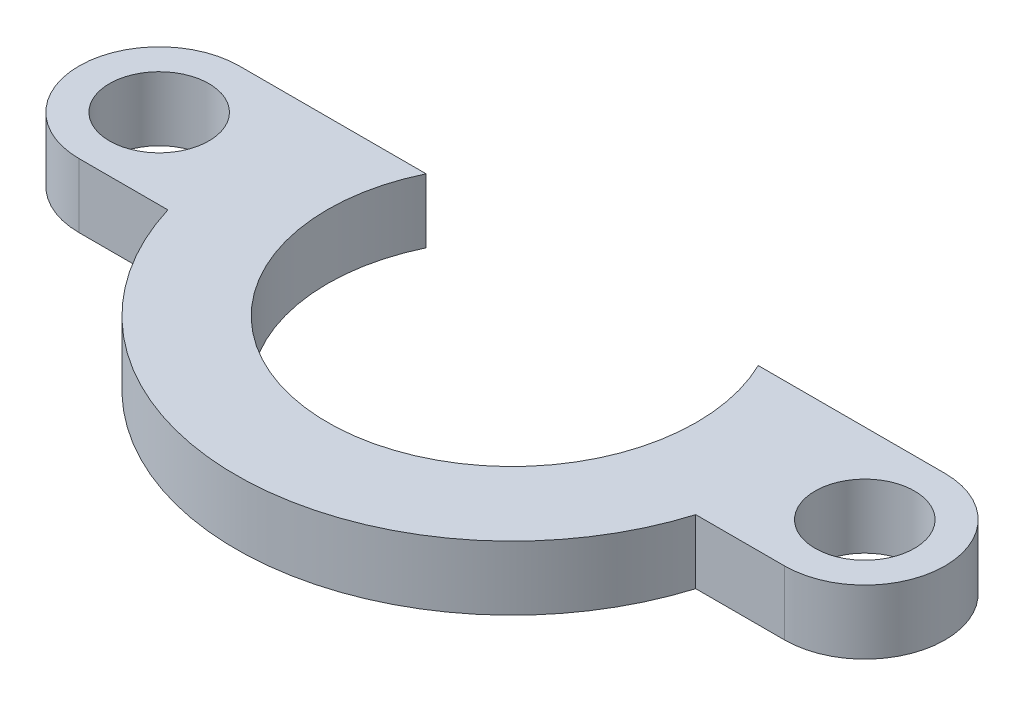
ISO-10303-21;
HEADER;
FILE_DESCRIPTION(('STEP AP214'),'2;1');
FILE_NAME('part.step','',(''),(''),'','','');
FILE_SCHEMA(('AUTOMOTIVE_DESIGN { 1 0 10303 214 1 1 1 1 }'));
ENDSEC;
DATA;
#1=APPLICATION_CONTEXT('core data for automotive mechanical design processes');
#2=APPLICATION_PROTOCOL_DEFINITION('international standard','automotive_design',2000,#1);
#3=PRODUCT_CONTEXT('',#1,'mechanical');
#4=PRODUCT('Part','Part','',(#3));
#5=PRODUCT_RELATED_PRODUCT_CATEGORY('part','',(#4));
#6=PRODUCT_DEFINITION_FORMATION('','',#4);
#7=PRODUCT_DEFINITION_CONTEXT('part definition',#1,'design');
#8=PRODUCT_DEFINITION('design','',#6,#7);
#9=PRODUCT_DEFINITION_SHAPE('','',#8);
#10=(LENGTH_UNIT() NAMED_UNIT(*) SI_UNIT(.MILLI.,.METRE.));
#11=(NAMED_UNIT(*) PLANE_ANGLE_UNIT() SI_UNIT($,.RADIAN.));
#12=(NAMED_UNIT(*) SI_UNIT($,.STERADIAN.) SOLID_ANGLE_UNIT());
#13=UNCERTAINTY_MEASURE_WITH_UNIT(LENGTH_MEASURE(1.E-05),#10,'distance_accuracy_value','');
#14=(GEOMETRIC_REPRESENTATION_CONTEXT(3) GLOBAL_UNCERTAINTY_ASSIGNED_CONTEXT((#13)) GLOBAL_UNIT_ASSIGNED_CONTEXT((#10,
#11,#12)) REPRESENTATION_CONTEXT('',''));
#15=CARTESIAN_POINT('',(0.,0.,0.));
#16=DIRECTION('',(0.,0.,1.));
#17=DIRECTION('',(1.,0.,0.));
#18=AXIS2_PLACEMENT_3D('',#15,#16,#17);
#19=CARTESIAN_POINT('',(0.,0.,0.));
#20=DIRECTION('',(0.,1.,0.));
#21=DIRECTION('',(0.,0.,1.));
#22=AXIS2_PLACEMENT_3D('',#19,#20,#21);
#23=PLANE('',#22);
#24=CARTESIAN_POINT('',(-11.,0.,0.));
#25=DIRECTION('',(0.,1.,0.));
#26=DIRECTION('',(0.,0.,1.));
#27=AXIS2_PLACEMENT_3D('',#24,#25,#26);
#28=CIRCLE('',#27,2.5);
#29=CARTESIAN_POINT('',(-11.,0.,-2.5));
#30=VERTEX_POINT('',#29);
#31=CARTESIAN_POINT('',(-11.,0.,2.5));
#32=VERTEX_POINT('',#31);
#33=EDGE_CURVE('E115',#30,#32,#28,.T.);
#34=ORIENTED_EDGE('',*,*,#33,.F.);
#35=DIRECTION('',(1.,0.,0.));
#36=VECTOR('',#35,1.);
#37=CARTESIAN_POINT('',(0.,0.,-2.5));
#38=LINE('',#37,#36);
#39=CARTESIAN_POINT('',(-5.178078794302,0.,-2.5));
#40=VERTEX_POINT('',#39);
#41=EDGE_CURVE('E223',#30,#40,#38,.T.);
#42=ORIENTED_EDGE('',*,*,#41,.T.);
#43=CARTESIAN_POINT('',(0.,0.,0.));
#44=DIRECTION('',(0.,1.,0.));
#45=DIRECTION('',(0.,0.,1.));
#46=AXIS2_PLACEMENT_3D('',#43,#44,#45);
#47=CIRCLE('',#46,5.75);
#48=CARTESIAN_POINT('',(5.17807879430199,0.,-2.5));
#49=VERTEX_POINT('',#48);
#50=EDGE_CURVE('E220',#40,#49,#47,.T.);
#51=ORIENTED_EDGE('',*,*,#50,.T.);
#52=DIRECTION('',(1.,0.,0.));
#53=VECTOR('',#52,1.);
#54=CARTESIAN_POINT('',(0.,0.,-2.5));
#55=LINE('',#54,#53);
#56=CARTESIAN_POINT('',(11.,0.,-2.5));
#57=VERTEX_POINT('',#56);
#58=EDGE_CURVE('E217',#49,#57,#55,.T.);
#59=ORIENTED_EDGE('',*,*,#58,.T.);
#60=CARTESIAN_POINT('',(11.,0.,0.));
#61=DIRECTION('',(0.,1.,0.));
#62=DIRECTION('',(0.,0.,1.));
#63=AXIS2_PLACEMENT_3D('',#60,#61,#62);
#64=CIRCLE('',#63,2.5);
#65=CARTESIAN_POINT('',(11.,0.,2.5));
#66=VERTEX_POINT('',#65);
#67=EDGE_CURVE('E214',#66,#57,#64,.T.);
#68=ORIENTED_EDGE('',*,*,#67,.F.);
#69=DIRECTION('',(1.,0.,0.));
#70=VECTOR('',#69,1.);
#71=CARTESIAN_POINT('',(0.,0.,2.5));
#72=LINE('',#71,#70);
#73=CARTESIAN_POINT('',(8.22860863086828,0.,2.5));
#74=VERTEX_POINT('',#73);
#75=EDGE_CURVE('E164',#74,#66,#72,.T.);
#76=ORIENTED_EDGE('',*,*,#75,.F.);
#77=CARTESIAN_POINT('',(0.,0.,0.));
#78=DIRECTION('',(0.,1.,0.));
#79=DIRECTION('',(0.,0.,1.));
#80=AXIS2_PLACEMENT_3D('',#77,#78,#79);
#81=CIRCLE('',#80,8.6);
#82=CARTESIAN_POINT('',(-8.22860863086828,0.,2.5));
#83=VERTEX_POINT('',#82);
#84=EDGE_CURVE('E158',#83,#74,#81,.T.);
#85=ORIENTED_EDGE('',*,*,#84,.F.);
#86=DIRECTION('',(1.,0.,0.));
#87=VECTOR('',#86,1.);
#88=CARTESIAN_POINT('',(0.,0.,2.5));
#89=LINE('',#88,#87);
#90=EDGE_CURVE('E201',#32,#83,#89,.T.);
#91=ORIENTED_EDGE('',*,*,#90,.F.);
#92=EDGE_LOOP('',(#34,#42,#51,#59,#68,#76,#85,#91));
#93=FACE_BOUND('',#92,.T.);
#94=CARTESIAN_POINT('',(11.,0.,0.));
#95=DIRECTION('',(0.,1.,0.));
#96=DIRECTION('',(0.,0.,1.));
#97=AXIS2_PLACEMENT_3D('',#94,#95,#96);
#98=CIRCLE('',#97,1.55);
#99=CARTESIAN_POINT('',(11.,0.,1.55));
#100=VERTEX_POINT('',#99);
#101=EDGE_CURVE('E211',#100,#100,#98,.T.);
#102=ORIENTED_EDGE('',*,*,#101,.T.);
#103=EDGE_LOOP('',(#102));
#104=FACE_BOUND('',#103,.T.);
#105=CARTESIAN_POINT('',(-11.,0.,0.));
#106=DIRECTION('',(0.,1.,0.));
#107=DIRECTION('',(0.,0.,1.));
#108=AXIS2_PLACEMENT_3D('',#105,#106,#107);
#109=CIRCLE('',#108,1.55);
#110=CARTESIAN_POINT('',(-11.,0.,1.55));
#111=VERTEX_POINT('',#110);
#112=EDGE_CURVE('E241',#111,#111,#109,.T.);
#113=ORIENTED_EDGE('',*,*,#112,.T.);
#114=EDGE_LOOP('',(#113));
#115=FACE_BOUND('',#114,.T.);
#116=ADVANCED_FACE('F111',(#93,#104,#115),#23,.F.);
#117=CARTESIAN_POINT('',(0.,2.,0.));
#118=DIRECTION('',(0.,1.,0.));
#119=DIRECTION('',(0.,0.,1.));
#120=AXIS2_PLACEMENT_3D('',#117,#118,#119);
#121=PLANE('',#120);
#122=DIRECTION('',(1.,0.,0.));
#123=VECTOR('',#122,1.);
#124=CARTESIAN_POINT('',(0.,2.,-2.5));
#125=LINE('',#124,#123);
#126=CARTESIAN_POINT('',(-11.,2.,-2.5));
#127=VERTEX_POINT('',#126);
#128=CARTESIAN_POINT('',(-5.178078794302,2.,-2.5));
#129=VERTEX_POINT('',#128);
#130=EDGE_CURVE('E196',#127,#129,#125,.T.);
#131=ORIENTED_EDGE('',*,*,#130,.F.);
#132=CARTESIAN_POINT('',(-11.,2.,0.));
#133=DIRECTION('',(0.,1.,0.));
#134=DIRECTION('',(0.,0.,1.));
#135=AXIS2_PLACEMENT_3D('',#132,#133,#134);
#136=CIRCLE('',#135,2.5);
#137=CARTESIAN_POINT('',(-11.,2.,2.5));
#138=VERTEX_POINT('',#137);
#139=EDGE_CURVE('E194',#127,#138,#136,.T.);
#140=ORIENTED_EDGE('',*,*,#139,.T.);
#141=DIRECTION('',(1.,0.,0.));
#142=VECTOR('',#141,1.);
#143=CARTESIAN_POINT('',(0.,2.,2.5));
#144=LINE('',#143,#142);
#145=CARTESIAN_POINT('',(-8.22860863086828,2.,2.5));
#146=VERTEX_POINT('',#145);
#147=EDGE_CURVE('E186',#138,#146,#144,.T.);
#148=ORIENTED_EDGE('',*,*,#147,.T.);
#149=CARTESIAN_POINT('',(0.,2.,0.));
#150=DIRECTION('',(0.,1.,0.));
#151=DIRECTION('',(0.,0.,1.));
#152=AXIS2_PLACEMENT_3D('',#149,#150,#151);
#153=CIRCLE('',#152,8.6);
#154=CARTESIAN_POINT('',(8.22860863086828,2.,2.5));
#155=VERTEX_POINT('',#154);
#156=EDGE_CURVE('E192',#146,#155,#153,.T.);
#157=ORIENTED_EDGE('',*,*,#156,.T.);
#158=DIRECTION('',(1.,0.,0.));
#159=VECTOR('',#158,1.);
#160=CARTESIAN_POINT('',(0.,2.,2.5));
#161=LINE('',#160,#159);
#162=CARTESIAN_POINT('',(11.,2.,2.5));
#163=VERTEX_POINT('',#162);
#164=EDGE_CURVE('E130',#155,#163,#161,.T.);
#165=ORIENTED_EDGE('',*,*,#164,.T.);
#166=CARTESIAN_POINT('',(11.,2.,0.));
#167=DIRECTION('',(0.,1.,0.));
#168=DIRECTION('',(0.,0.,1.));
#169=AXIS2_PLACEMENT_3D('',#166,#167,#168);
#170=CIRCLE('',#169,2.5);
#171=CARTESIAN_POINT('',(11.,2.,-2.5));
#172=VERTEX_POINT('',#171);
#173=EDGE_CURVE('E170',#163,#172,#170,.T.);
#174=ORIENTED_EDGE('',*,*,#173,.T.);
#175=DIRECTION('',(1.,0.,0.));
#176=VECTOR('',#175,1.);
#177=CARTESIAN_POINT('',(0.,2.,-2.5));
#178=LINE('',#177,#176);
#179=CARTESIAN_POINT('',(5.17807879430199,2.,-2.5));
#180=VERTEX_POINT('',#179);
#181=EDGE_CURVE('E447',#180,#172,#178,.T.);
#182=ORIENTED_EDGE('',*,*,#181,.F.);
#183=CARTESIAN_POINT('',(0.,2.,0.));
#184=DIRECTION('',(0.,1.,0.));
#185=DIRECTION('',(0.,0.,1.));
#186=AXIS2_PLACEMENT_3D('',#183,#184,#185);
#187=CIRCLE('',#186,5.75);
#188=EDGE_CURVE('E451',#129,#180,#187,.T.);
#189=ORIENTED_EDGE('',*,*,#188,.F.);
#190=EDGE_LOOP('',(#131,#140,#148,#157,#165,#174,#182,#189));
#191=FACE_BOUND('',#190,.T.);
#192=CARTESIAN_POINT('',(11.,2.,0.));
#193=DIRECTION('',(0.,1.,0.));
#194=DIRECTION('',(0.,0.,1.));
#195=AXIS2_PLACEMENT_3D('',#192,#193,#194);
#196=CIRCLE('',#195,1.55);
#197=CARTESIAN_POINT('',(11.,2.,1.55));
#198=VERTEX_POINT('',#197);
#199=EDGE_CURVE('E229',#198,#198,#196,.T.);
#200=ORIENTED_EDGE('',*,*,#199,.F.);
#201=EDGE_LOOP('',(#200));
#202=FACE_BOUND('',#201,.T.);
#203=CARTESIAN_POINT('',(-11.,2.,0.));
#204=DIRECTION('',(0.,1.,0.));
#205=DIRECTION('',(0.,0.,1.));
#206=AXIS2_PLACEMENT_3D('',#203,#204,#205);
#207=CIRCLE('',#206,1.55);
#208=CARTESIAN_POINT('',(-11.,2.,1.55));
#209=VERTEX_POINT('',#208);
#210=EDGE_CURVE('E238',#209,#209,#207,.T.);
#211=ORIENTED_EDGE('',*,*,#210,.F.);
#212=EDGE_LOOP('',(#211));
#213=FACE_BOUND('',#212,.T.);
#214=ADVANCED_FACE('F189',(#191,#202,#213),#121,.T.);
#215=CARTESIAN_POINT('',(0.,2.,2.5));
#216=DIRECTION('',(0.,0.,-1.));
#217=DIRECTION('',(-1.,0.,0.));
#218=AXIS2_PLACEMENT_3D('',#215,#216,#217);
#219=PLANE('',#218);
#220=ORIENTED_EDGE('',*,*,#90,.T.);
#221=DIRECTION('',(0.,-1.,0.));
#222=VECTOR('',#221,1.);
#223=CARTESIAN_POINT('',(-8.22860863086828,2.,2.5));
#224=LINE('',#223,#222);
#225=EDGE_CURVE('E198',#146,#83,#224,.T.);
#226=ORIENTED_EDGE('',*,*,#225,.F.);
#227=ORIENTED_EDGE('',*,*,#147,.F.);
#228=DIRECTION('',(0.,-1.,0.));
#229=VECTOR('',#228,1.);
#230=CARTESIAN_POINT('',(-11.,2.,2.5));
#231=LINE('',#230,#229);
#232=EDGE_CURVE('E202',#138,#32,#231,.T.);
#233=ORIENTED_EDGE('',*,*,#232,.T.);
#234=EDGE_LOOP('',(#220,#226,#227,#233));
#235=FACE_BOUND('',#234,.T.);
#236=ADVANCED_FACE('F199',(#235),#219,.F.);
#237=CARTESIAN_POINT('',(0.,2.,0.));
#238=DIRECTION('',(0.,-1.,0.));
#239=DIRECTION('',(0.,0.,-1.));
#240=AXIS2_PLACEMENT_3D('',#237,#238,#239);
#241=CYLINDRICAL_SURFACE('',#240,8.6);
#242=ORIENTED_EDGE('',*,*,#84,.T.);
#243=DIRECTION('',(0.,-1.,0.));
#244=VECTOR('',#243,1.);
#245=CARTESIAN_POINT('',(8.22860863086828,2.,2.5));
#246=LINE('',#245,#244);
#247=EDGE_CURVE('E203',#155,#74,#246,.T.);
#248=ORIENTED_EDGE('',*,*,#247,.F.);
#249=ORIENTED_EDGE('',*,*,#156,.F.);
#250=ORIENTED_EDGE('',*,*,#225,.T.);
#251=EDGE_LOOP('',(#242,#248,#249,#250));
#252=FACE_BOUND('',#251,.T.);
#253=ADVANCED_FACE('F205',(#252),#241,.T.);
#254=CARTESIAN_POINT('',(0.,2.,2.5));
#255=DIRECTION('',(0.,0.,-1.));
#256=DIRECTION('',(-1.,0.,0.));
#257=AXIS2_PLACEMENT_3D('',#254,#255,#256);
#258=PLANE('',#257);
#259=ORIENTED_EDGE('',*,*,#75,.T.);
#260=DIRECTION('',(0.,-1.,0.));
#261=VECTOR('',#260,1.);
#262=CARTESIAN_POINT('',(11.,2.,2.5));
#263=LINE('',#262,#261);
#264=EDGE_CURVE('E207',#163,#66,#263,.T.);
#265=ORIENTED_EDGE('',*,*,#264,.F.);
#266=ORIENTED_EDGE('',*,*,#164,.F.);
#267=ORIENTED_EDGE('',*,*,#247,.T.);
#268=EDGE_LOOP('',(#259,#265,#266,#267));
#269=FACE_BOUND('',#268,.T.);
#270=ADVANCED_FACE('F254',(#269),#258,.F.);
#271=CARTESIAN_POINT('',(11.,2.,0.));
#272=DIRECTION('',(0.,-1.,0.));
#273=DIRECTION('',(0.,0.,-1.));
#274=AXIS2_PLACEMENT_3D('',#271,#272,#273);
#275=CYLINDRICAL_SURFACE('',#274,2.5);
#276=ORIENTED_EDGE('',*,*,#67,.T.);
#277=DIRECTION('',(0.,-1.,0.));
#278=VECTOR('',#277,1.);
#279=CARTESIAN_POINT('',(11.,2.,-2.5));
#280=LINE('',#279,#278);
#281=EDGE_CURVE('E12',#172,#57,#280,.T.);
#282=ORIENTED_EDGE('',*,*,#281,.F.);
#283=ORIENTED_EDGE('',*,*,#173,.F.);
#284=ORIENTED_EDGE('',*,*,#264,.T.);
#285=EDGE_LOOP('',(#276,#282,#283,#284));
#286=FACE_BOUND('',#285,.T.);
#287=ADVANCED_FACE('F252',(#286),#275,.T.);
#288=CARTESIAN_POINT('',(0.,2.,-2.5));
#289=DIRECTION('',(0.,0.,-1.));
#290=DIRECTION('',(-1.,0.,0.));
#291=AXIS2_PLACEMENT_3D('',#288,#289,#290);
#292=PLANE('',#291);
#293=ORIENTED_EDGE('',*,*,#58,.F.);
#294=DIRECTION('',(0.,-1.,0.));
#295=VECTOR('',#294,1.);
#296=CARTESIAN_POINT('',(5.17807879430199,2.,-2.5));
#297=LINE('',#296,#295);
#298=EDGE_CURVE('E121',#180,#49,#297,.T.);
#299=ORIENTED_EDGE('',*,*,#298,.F.);
#300=ORIENTED_EDGE('',*,*,#181,.T.);
#301=ORIENTED_EDGE('',*,*,#281,.T.);
#302=EDGE_LOOP('',(#293,#299,#300,#301));
#303=FACE_BOUND('',#302,.T.);
#304=ADVANCED_FACE('F261',(#303),#292,.T.);
#305=CARTESIAN_POINT('',(0.,2.,0.));
#306=DIRECTION('',(0.,-1.,0.));
#307=DIRECTION('',(0.,0.,-1.));
#308=AXIS2_PLACEMENT_3D('',#305,#306,#307);
#309=CYLINDRICAL_SURFACE('',#308,5.75);
#310=ORIENTED_EDGE('',*,*,#50,.F.);
#311=DIRECTION('',(0.,-1.,0.));
#312=VECTOR('',#311,1.);
#313=CARTESIAN_POINT('',(-5.178078794302,2.,-2.5));
#314=LINE('',#313,#312);
#315=EDGE_CURVE('E235',#129,#40,#314,.T.);
#316=ORIENTED_EDGE('',*,*,#315,.F.);
#317=ORIENTED_EDGE('',*,*,#188,.T.);
#318=ORIENTED_EDGE('',*,*,#298,.T.);
#319=EDGE_LOOP('',(#310,#316,#317,#318));
#320=FACE_BOUND('',#319,.T.);
#321=ADVANCED_FACE('F276',(#320),#309,.F.);
#322=CARTESIAN_POINT('',(0.,2.,-2.5));
#323=DIRECTION('',(0.,0.,-1.));
#324=DIRECTION('',(-1.,0.,0.));
#325=AXIS2_PLACEMENT_3D('',#322,#323,#324);
#326=PLANE('',#325);
#327=ORIENTED_EDGE('',*,*,#41,.F.);
#328=DIRECTION('',(0.,-1.,0.));
#329=VECTOR('',#328,1.);
#330=CARTESIAN_POINT('',(-11.,2.,-2.5));
#331=LINE('',#330,#329);
#332=EDGE_CURVE('E233',#127,#30,#331,.T.);
#333=ORIENTED_EDGE('',*,*,#332,.F.);
#334=ORIENTED_EDGE('',*,*,#130,.T.);
#335=ORIENTED_EDGE('',*,*,#315,.T.);
#336=EDGE_LOOP('',(#327,#333,#334,#335));
#337=FACE_BOUND('',#336,.T.);
#338=ADVANCED_FACE('F272',(#337),#326,.T.);
#339=CARTESIAN_POINT('',(11.,2.,0.));
#340=DIRECTION('',(0.,-1.,0.));
#341=DIRECTION('',(0.,0.,-1.));
#342=AXIS2_PLACEMENT_3D('',#339,#340,#341);
#343=CYLINDRICAL_SURFACE('',#342,1.55);
#344=ORIENTED_EDGE('',*,*,#199,.T.);
#345=EDGE_LOOP('',(#344));
#346=FACE_BOUND('',#345,.T.);
#347=ORIENTED_EDGE('',*,*,#101,.F.);
#348=EDGE_LOOP('',(#347));
#349=FACE_BOUND('',#348,.T.);
#350=ADVANCED_FACE('F275',(#346,#349),#343,.F.);
#351=CARTESIAN_POINT('',(-11.,2.,0.));
#352=DIRECTION('',(0.,-1.,0.));
#353=DIRECTION('',(0.,0.,-1.));
#354=AXIS2_PLACEMENT_3D('',#351,#352,#353);
#355=CYLINDRICAL_SURFACE('',#354,2.5);
#356=ORIENTED_EDGE('',*,*,#332,.T.);
#357=ORIENTED_EDGE('',*,*,#33,.T.);
#358=ORIENTED_EDGE('',*,*,#232,.F.);
#359=ORIENTED_EDGE('',*,*,#139,.F.);
#360=EDGE_LOOP('',(#356,#357,#358,#359));
#361=FACE_BOUND('',#360,.T.);
#362=ADVANCED_FACE('F113',(#361),#355,.T.);
#363=CARTESIAN_POINT('',(-11.,2.,0.));
#364=DIRECTION('',(0.,-1.,0.));
#365=DIRECTION('',(0.,0.,-1.));
#366=AXIS2_PLACEMENT_3D('',#363,#364,#365);
#367=CYLINDRICAL_SURFACE('',#366,1.55);
#368=ORIENTED_EDGE('',*,*,#210,.T.);
#369=EDGE_LOOP('',(#368));
#370=FACE_BOUND('',#369,.T.);
#371=ORIENTED_EDGE('',*,*,#112,.F.);
#372=EDGE_LOOP('',(#371));
#373=FACE_BOUND('',#372,.T.);
#374=ADVANCED_FACE('F286',(#370,#373),#367,.F.);
#375=CLOSED_SHELL('',(#116,#214,#236,#253,#270,#287,#304,#321,#338,#350,#362,#374));
#376=MANIFOLD_SOLID_BREP('B2',#375);
#377=ADVANCED_BREP_SHAPE_REPRESENTATION('',(#18,#376),#14);
#378=SHAPE_DEFINITION_REPRESENTATION(#9,#377);
ENDSEC;
END-ISO-10303-21;
